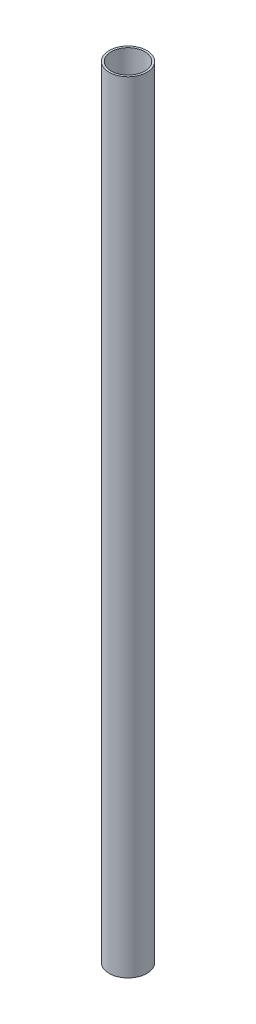
ISO-10303-21;
HEADER;
FILE_DESCRIPTION(('STEP AP214'),'2;1');
FILE_NAME('part.step','',(''),(''),'','','');
FILE_SCHEMA(('AUTOMOTIVE_DESIGN { 1 0 10303 214 1 1 1 1 }'));
ENDSEC;
DATA;
#1=APPLICATION_CONTEXT('core data for automotive mechanical design processes');
#2=APPLICATION_PROTOCOL_DEFINITION('international standard','automotive_design',2000,#1);
#3=PRODUCT_CONTEXT('',#1,'mechanical');
#4=PRODUCT('Part','Part','',(#3));
#5=PRODUCT_RELATED_PRODUCT_CATEGORY('part','',(#4));
#6=PRODUCT_DEFINITION_FORMATION('','',#4);
#7=PRODUCT_DEFINITION_CONTEXT('part definition',#1,'design');
#8=PRODUCT_DEFINITION('design','',#6,#7);
#9=PRODUCT_DEFINITION_SHAPE('','',#8);
#10=(LENGTH_UNIT() NAMED_UNIT(*) SI_UNIT(.MILLI.,.METRE.));
#11=(NAMED_UNIT(*) PLANE_ANGLE_UNIT() SI_UNIT($,.RADIAN.));
#12=(NAMED_UNIT(*) SI_UNIT($,.STERADIAN.) SOLID_ANGLE_UNIT());
#13=UNCERTAINTY_MEASURE_WITH_UNIT(LENGTH_MEASURE(1.E-05),#10,'distance_accuracy_value','');
#14=(GEOMETRIC_REPRESENTATION_CONTEXT(3) GLOBAL_UNCERTAINTY_ASSIGNED_CONTEXT((#13)) GLOBAL_UNIT_ASSIGNED_CONTEXT((#10,
#11,#12)) REPRESENTATION_CONTEXT('',''));
#15=CARTESIAN_POINT('',(0.,0.,0.));
#16=DIRECTION('',(0.,0.,1.));
#17=DIRECTION('',(1.,0.,0.));
#18=AXIS2_PLACEMENT_3D('',#15,#16,#17);
#19=CARTESIAN_POINT('',(0.,241.3,0.));
#20=DIRECTION('',(0.,1.,0.));
#21=DIRECTION('',(0.,0.,1.));
#22=AXIS2_PLACEMENT_3D('',#19,#20,#21);
#23=PLANE('',#22);
#24=CARTESIAN_POINT('',(0.,241.3,0.));
#25=DIRECTION('',(0.,1.,0.));
#26=DIRECTION('',(0.,0.,1.));
#27=AXIS2_PLACEMENT_3D('',#24,#25,#26);
#28=CIRCLE('',#27,11.665);
#29=CARTESIAN_POINT('',(0.,241.3,-11.665));
#30=VERTEX_POINT('',#29);
#31=EDGE_CURVE('E10',#30,#30,#28,.T.);
#32=ORIENTED_EDGE('',*,*,#31,.T.);
#33=EDGE_LOOP('',(#32));
#34=FACE_BOUND('',#33,.T.);
#35=CARTESIAN_POINT('',(0.,241.3,0.));
#36=DIRECTION('',(0.,1.,0.));
#37=DIRECTION('',(0.,0.,1.));
#38=AXIS2_PLACEMENT_3D('',#35,#36,#37);
#39=CIRCLE('',#38,10.395);
#40=CARTESIAN_POINT('',(0.,241.3,-10.395));
#41=VERTEX_POINT('',#40);
#42=EDGE_CURVE('E48',#41,#41,#39,.T.);
#43=ORIENTED_EDGE('',*,*,#42,.F.);
#44=EDGE_LOOP('',(#43));
#45=FACE_BOUND('',#44,.T.);
#46=ADVANCED_FACE('F37',(#34,#45),#23,.T.);
#47=CARTESIAN_POINT('',(0.,-241.3,0.));
#48=DIRECTION('',(0.,1.,0.));
#49=DIRECTION('',(0.,0.,1.));
#50=AXIS2_PLACEMENT_3D('',#47,#48,#49);
#51=PLANE('',#50);
#52=CARTESIAN_POINT('',(0.,-241.3,0.));
#53=DIRECTION('',(0.,1.,0.));
#54=DIRECTION('',(0.,0.,1.));
#55=AXIS2_PLACEMENT_3D('',#52,#53,#54);
#56=CIRCLE('',#55,11.665);
#57=CARTESIAN_POINT('',(0.,-241.3,-11.665));
#58=VERTEX_POINT('',#57);
#59=EDGE_CURVE('E41',#58,#58,#56,.T.);
#60=ORIENTED_EDGE('',*,*,#59,.F.);
#61=EDGE_LOOP('',(#60));
#62=FACE_BOUND('',#61,.T.);
#63=CARTESIAN_POINT('',(0.,-241.3,0.));
#64=DIRECTION('',(0.,1.,0.));
#65=DIRECTION('',(0.,0.,1.));
#66=AXIS2_PLACEMENT_3D('',#63,#64,#65);
#67=CIRCLE('',#66,10.395);
#68=CARTESIAN_POINT('',(0.,-241.3,-10.395));
#69=VERTEX_POINT('',#68);
#70=EDGE_CURVE('E50',#69,#69,#67,.T.);
#71=ORIENTED_EDGE('',*,*,#70,.T.);
#72=EDGE_LOOP('',(#71));
#73=FACE_BOUND('',#72,.T.);
#74=ADVANCED_FACE('F60',(#62,#73),#51,.F.);
#75=CARTESIAN_POINT('',(0.,241.3,0.));
#76=DIRECTION('',(0.,-1.,0.));
#77=DIRECTION('',(0.,0.,-1.));
#78=AXIS2_PLACEMENT_3D('',#75,#76,#77);
#79=CYLINDRICAL_SURFACE('',#78,11.665);
#80=CARTESIAN_POINT('',(0.,241.3,-11.665));
#81=CARTESIAN_POINT('',(0.,236.272916666667,-11.665));
#82=CARTESIAN_POINT('',(0.,231.245833333333,-11.665));
#83=CARTESIAN_POINT('',(0.,221.191666666667,-11.665));
#84=CARTESIAN_POINT('',(0.,216.164583333333,-11.665));
#85=CARTESIAN_POINT('',(0.,206.110416666667,-11.665));
#86=CARTESIAN_POINT('',(0.,201.083333333333,-11.665));
#87=CARTESIAN_POINT('',(0.,191.029166666667,-11.665));
#88=CARTESIAN_POINT('',(0.,186.002083333333,-11.665));
#89=CARTESIAN_POINT('',(0.,175.947916666667,-11.665));
#90=CARTESIAN_POINT('',(0.,170.920833333333,-11.665));
#91=CARTESIAN_POINT('',(0.,160.866666666667,-11.665));
#92=CARTESIAN_POINT('',(0.,155.839583333333,-11.665));
#93=CARTESIAN_POINT('',(0.,145.785416666667,-11.665));
#94=CARTESIAN_POINT('',(0.,140.758333333333,-11.665));
#95=CARTESIAN_POINT('',(0.,130.704166666667,-11.665));
#96=CARTESIAN_POINT('',(0.,125.677083333333,-11.665));
#97=CARTESIAN_POINT('',(0.,115.622916666667,-11.665));
#98=CARTESIAN_POINT('',(0.,110.595833333333,-11.665));
#99=CARTESIAN_POINT('',(0.,100.541666666667,-11.665));
#100=CARTESIAN_POINT('',(0.,95.5145833333333,-11.665));
#101=CARTESIAN_POINT('',(0.,85.4604166666667,-11.665));
#102=CARTESIAN_POINT('',(0.,80.4333333333333,-11.665));
#103=CARTESIAN_POINT('',(0.,70.3791666666667,-11.665));
#104=CARTESIAN_POINT('',(0.,65.3520833333334,-11.665));
#105=CARTESIAN_POINT('',(0.,55.2979166666667,-11.665));
#106=CARTESIAN_POINT('',(0.,50.2708333333333,-11.665));
#107=CARTESIAN_POINT('',(0.,40.2166666666667,-11.665));
#108=CARTESIAN_POINT('',(0.,35.1895833333333,-11.665));
#109=CARTESIAN_POINT('',(0.,25.1354166666667,-11.665));
#110=CARTESIAN_POINT('',(0.,20.1083333333333,-11.665));
#111=CARTESIAN_POINT('',(0.,10.0541666666667,-11.665));
#112=CARTESIAN_POINT('',(0.,5.02708333333333,-11.665));
#113=CARTESIAN_POINT('',(0.,-5.02708333333332,-11.665));
#114=CARTESIAN_POINT('',(0.,-10.0541666666666,-11.665));
#115=CARTESIAN_POINT('',(0.,-20.1083333333333,-11.665));
#116=CARTESIAN_POINT('',(0.,-25.1354166666666,-11.665));
#117=CARTESIAN_POINT('',(0.,-35.1895833333333,-11.665));
#118=CARTESIAN_POINT('',(0.,-40.2166666666666,-11.665));
#119=CARTESIAN_POINT('',(0.,-50.2708333333333,-11.665));
#120=CARTESIAN_POINT('',(0.,-55.2979166666667,-11.665));
#121=CARTESIAN_POINT('',(0.,-65.3520833333333,-11.665));
#122=CARTESIAN_POINT('',(0.,-70.3791666666666,-11.665));
#123=CARTESIAN_POINT('',(0.,-80.4333333333333,-11.665));
#124=CARTESIAN_POINT('',(0.,-85.4604166666666,-11.665));
#125=CARTESIAN_POINT('',(0.,-95.5145833333333,-11.665));
#126=CARTESIAN_POINT('',(0.,-100.541666666667,-11.665));
#127=CARTESIAN_POINT('',(0.,-110.595833333333,-11.665));
#128=CARTESIAN_POINT('',(0.,-115.622916666667,-11.665));
#129=CARTESIAN_POINT('',(0.,-125.677083333333,-11.665));
#130=CARTESIAN_POINT('',(0.,-130.704166666667,-11.665));
#131=CARTESIAN_POINT('',(0.,-140.758333333333,-11.665));
#132=CARTESIAN_POINT('',(0.,-145.785416666667,-11.665));
#133=CARTESIAN_POINT('',(0.,-155.839583333333,-11.665));
#134=CARTESIAN_POINT('',(0.,-160.866666666667,-11.665));
#135=CARTESIAN_POINT('',(0.,-170.920833333333,-11.665));
#136=CARTESIAN_POINT('',(0.,-175.947916666667,-11.665));
#137=CARTESIAN_POINT('',(0.,-186.002083333333,-11.665));
#138=CARTESIAN_POINT('',(0.,-191.029166666667,-11.665));
#139=CARTESIAN_POINT('',(0.,-201.083333333333,-11.665));
#140=CARTESIAN_POINT('',(0.,-206.110416666667,-11.665));
#141=CARTESIAN_POINT('',(0.,-216.164583333333,-11.665));
#142=CARTESIAN_POINT('',(0.,-221.191666666667,-11.665));
#143=CARTESIAN_POINT('',(0.,-231.245833333333,-11.665));
#144=CARTESIAN_POINT('',(0.,-236.272916666667,-11.665));
#145=CARTESIAN_POINT('',(0.,-241.3,-11.665));
#146=B_SPLINE_CURVE_WITH_KNOTS('',3,(#80,#81,#82,#83,#84,#85,#86,#87,#88,#89,#90,#91,#92,#93,
#94,#95,#96,#97,#98,#99,#100,#101,#102,#103,#104,#105,#106,#107,#108,#109,#110,#111,#112,#113,
#114,#115,#116,#117,#118,#119,#120,#121,#122,#123,#124,#125,#126,#127,#128,#129,#130,#131,#132,
#133,#134,#135,#136,#137,#138,#139,#140,#141,#142,#143,#144,#145),.UNSPECIFIED.,.F.,.F.,(4,2,2,
2,2,2,2,2,2,2,2,2,2,2,2,2,2,2,2,2,2,2,2,2,2,2,2,2,2,2,2,2,4),(0.,15.08125,30.1625,45.24375,
60.325,75.40625,90.4875,105.56875,120.65,135.73125,150.8125,165.89375,180.975,196.05625,
211.1375,226.21875,241.3,256.38125,271.4625,286.54375,301.625,316.70625,331.7875,346.86875,
361.95,377.03125,392.1125,407.19375,422.275,437.35625,452.4375,467.51875,482.6),.UNSPECIFIED.);
#147=EDGE_CURVE('BSEAM39',#30,#58,#146,.T.);
#148=ORIENTED_EDGE('',*,*,#31,.F.);
#149=ORIENTED_EDGE('',*,*,#59,.T.);
#150=ORIENTED_EDGE('',*,*,#147,.T.);
#151=ORIENTED_EDGE('',*,*,#147,.F.);
#152=EDGE_LOOP('',(#148,#150,#149,#151));
#153=FACE_BOUND('',#152,.T.);
#154=ADVANCED_FACE('F39',(#153),#79,.T.);
#155=CARTESIAN_POINT('',(0.,241.3,0.));
#156=DIRECTION('',(0.,-1.,0.));
#157=DIRECTION('',(0.,0.,-1.));
#158=AXIS2_PLACEMENT_3D('',#155,#156,#157);
#159=CYLINDRICAL_SURFACE('',#158,10.395);
#160=CARTESIAN_POINT('',(0.,241.3,-10.395));
#161=CARTESIAN_POINT('',(0.,236.272916666667,-10.395));
#162=CARTESIAN_POINT('',(0.,231.245833333333,-10.395));
#163=CARTESIAN_POINT('',(0.,221.191666666667,-10.395));
#164=CARTESIAN_POINT('',(0.,216.164583333333,-10.395));
#165=CARTESIAN_POINT('',(0.,206.110416666667,-10.395));
#166=CARTESIAN_POINT('',(0.,201.083333333333,-10.395));
#167=CARTESIAN_POINT('',(0.,191.029166666667,-10.395));
#168=CARTESIAN_POINT('',(0.,186.002083333333,-10.395));
#169=CARTESIAN_POINT('',(0.,175.947916666667,-10.395));
#170=CARTESIAN_POINT('',(0.,170.920833333333,-10.395));
#171=CARTESIAN_POINT('',(0.,160.866666666667,-10.395));
#172=CARTESIAN_POINT('',(0.,155.839583333333,-10.395));
#173=CARTESIAN_POINT('',(0.,145.785416666667,-10.395));
#174=CARTESIAN_POINT('',(0.,140.758333333333,-10.395));
#175=CARTESIAN_POINT('',(0.,130.704166666667,-10.395));
#176=CARTESIAN_POINT('',(0.,125.677083333333,-10.395));
#177=CARTESIAN_POINT('',(0.,115.622916666667,-10.395));
#178=CARTESIAN_POINT('',(0.,110.595833333333,-10.395));
#179=CARTESIAN_POINT('',(0.,100.541666666667,-10.395));
#180=CARTESIAN_POINT('',(0.,95.5145833333333,-10.395));
#181=CARTESIAN_POINT('',(0.,85.4604166666666,-10.395));
#182=CARTESIAN_POINT('',(0.,80.4333333333333,-10.395));
#183=CARTESIAN_POINT('',(0.,70.3791666666666,-10.395));
#184=CARTESIAN_POINT('',(0.,65.3520833333333,-10.395));
#185=CARTESIAN_POINT('',(0.,55.2979166666667,-10.395));
#186=CARTESIAN_POINT('',(0.,50.2708333333333,-10.395));
#187=CARTESIAN_POINT('',(0.,40.2166666666666,-10.395));
#188=CARTESIAN_POINT('',(0.,35.1895833333333,-10.395));
#189=CARTESIAN_POINT('',(0.,25.1354166666666,-10.395));
#190=CARTESIAN_POINT('',(0.,20.1083333333333,-10.395));
#191=CARTESIAN_POINT('',(0.,10.0541666666666,-10.395));
#192=CARTESIAN_POINT('',(0.,5.0270833333333,-10.395));
#193=CARTESIAN_POINT('',(0.,-5.02708333333334,-10.395));
#194=CARTESIAN_POINT('',(0.,-10.0541666666667,-10.395));
#195=CARTESIAN_POINT('',(0.,-20.1083333333333,-10.395));
#196=CARTESIAN_POINT('',(0.,-25.1354166666666,-10.395));
#197=CARTESIAN_POINT('',(0.,-35.1895833333333,-10.395));
#198=CARTESIAN_POINT('',(0.,-40.2166666666666,-10.395));
#199=CARTESIAN_POINT('',(0.,-50.2708333333333,-10.395));
#200=CARTESIAN_POINT('',(0.,-55.2979166666667,-10.395));
#201=CARTESIAN_POINT('',(0.,-65.3520833333333,-10.395));
#202=CARTESIAN_POINT('',(0.,-70.3791666666666,-10.395));
#203=CARTESIAN_POINT('',(0.,-80.4333333333333,-10.395));
#204=CARTESIAN_POINT('',(0.,-85.4604166666666,-10.395));
#205=CARTESIAN_POINT('',(0.,-95.5145833333333,-10.395));
#206=CARTESIAN_POINT('',(0.,-100.541666666667,-10.395));
#207=CARTESIAN_POINT('',(0.,-110.595833333333,-10.395));
#208=CARTESIAN_POINT('',(0.,-115.622916666667,-10.395));
#209=CARTESIAN_POINT('',(0.,-125.677083333333,-10.395));
#210=CARTESIAN_POINT('',(0.,-130.704166666667,-10.395));
#211=CARTESIAN_POINT('',(0.,-140.758333333333,-10.395));
#212=CARTESIAN_POINT('',(0.,-145.785416666667,-10.395));
#213=CARTESIAN_POINT('',(0.,-155.839583333333,-10.395));
#214=CARTESIAN_POINT('',(0.,-160.866666666667,-10.395));
#215=CARTESIAN_POINT('',(0.,-170.920833333333,-10.395));
#216=CARTESIAN_POINT('',(0.,-175.947916666667,-10.395));
#217=CARTESIAN_POINT('',(0.,-186.002083333333,-10.395));
#218=CARTESIAN_POINT('',(0.,-191.029166666667,-10.395));
#219=CARTESIAN_POINT('',(0.,-201.083333333333,-10.395));
#220=CARTESIAN_POINT('',(0.,-206.110416666667,-10.395));
#221=CARTESIAN_POINT('',(0.,-216.164583333333,-10.395));
#222=CARTESIAN_POINT('',(0.,-221.191666666667,-10.395));
#223=CARTESIAN_POINT('',(0.,-231.245833333333,-10.395));
#224=CARTESIAN_POINT('',(0.,-236.272916666667,-10.395));
#225=CARTESIAN_POINT('',(0.,-241.3,-10.395));
#226=B_SPLINE_CURVE_WITH_KNOTS('',3,(#160,#161,#162,#163,#164,#165,#166,#167,#168,#169,#170,
#171,#172,#173,#174,#175,#176,#177,#178,#179,#180,#181,#182,#183,#184,#185,#186,#187,#188,#189,
#190,#191,#192,#193,#194,#195,#196,#197,#198,#199,#200,#201,#202,#203,#204,#205,#206,#207,#208,
#209,#210,#211,#212,#213,#214,#215,#216,#217,#218,#219,#220,#221,#222,#223,#224,#225),
.UNSPECIFIED.,.F.,.F.,(4,2,2,2,2,2,2,2,2,2,2,2,2,2,2,2,2,2,2,2,2,2,2,2,2,2,2,2,2,2,2,2,4),(0.,
15.08125,30.1625,45.24375,60.325,75.40625,90.4875,105.56875,120.65,135.73125,150.8125,165.89375,
180.975,196.05625,211.1375,226.21875,241.3,256.38125,271.4625,286.54375,301.625,316.70625,
331.7875,346.86875,361.95,377.03125,392.1125,407.19375,422.275,437.35625,452.4375,467.51875,
482.6),.UNSPECIFIED.);
#227=EDGE_CURVE('BSEAM56',#41,#69,#226,.T.);
#228=ORIENTED_EDGE('',*,*,#42,.T.);
#229=ORIENTED_EDGE('',*,*,#70,.F.);
#230=ORIENTED_EDGE('',*,*,#227,.T.);
#231=ORIENTED_EDGE('',*,*,#227,.F.);
#232=EDGE_LOOP('',(#228,#230,#229,#231));
#233=FACE_BOUND('',#232,.T.);
#234=ADVANCED_FACE('F56',(#233),#159,.F.);
#235=CLOSED_SHELL('',(#46,#74,#154,#234));
#236=MANIFOLD_SOLID_BREP('B2',#235);
#237=ADVANCED_BREP_SHAPE_REPRESENTATION('',(#18,#236),#14);
#238=SHAPE_DEFINITION_REPRESENTATION(#9,#237);
ENDSEC;
END-ISO-10303-21;
